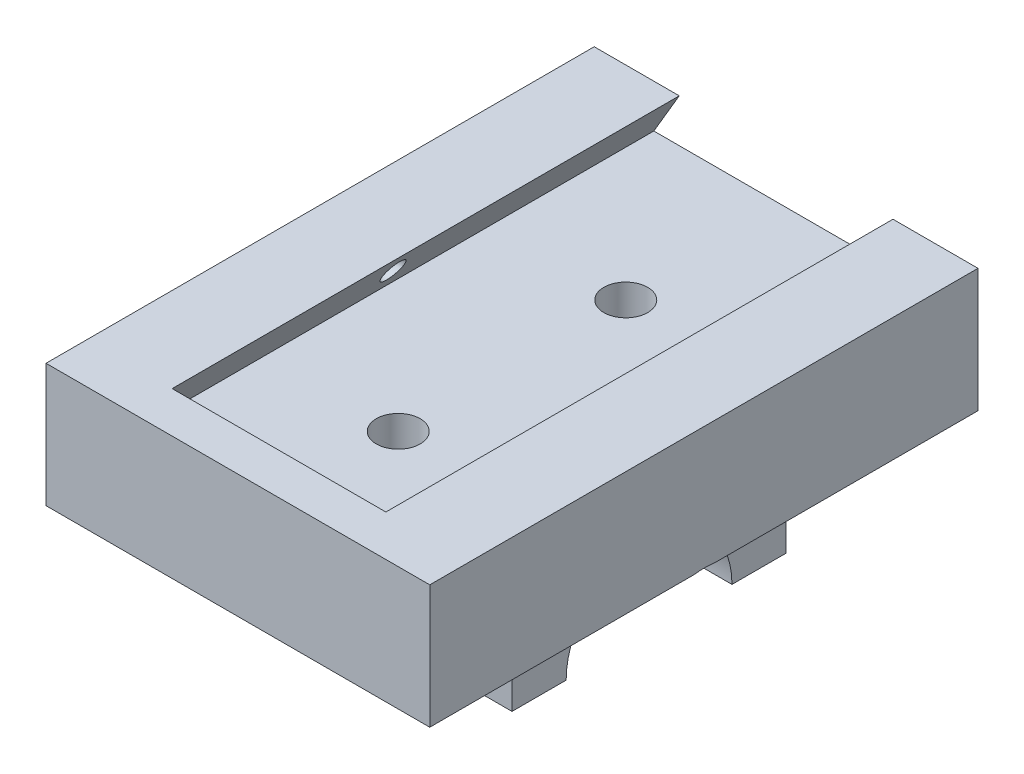
ISO-10303-21;
HEADER;
FILE_DESCRIPTION(('STEP AP214'),'2;1');
FILE_NAME('part.step','',(''),(''),'','','');
FILE_SCHEMA(('AUTOMOTIVE_DESIGN { 1 0 10303 214 1 1 1 1 }'));
ENDSEC;
DATA;
#1=APPLICATION_CONTEXT('core data for automotive mechanical design processes');
#2=APPLICATION_PROTOCOL_DEFINITION('international standard','automotive_design',2000,#1);
#3=PRODUCT_CONTEXT('',#1,'mechanical');
#4=PRODUCT('Part','Part','',(#3));
#5=PRODUCT_RELATED_PRODUCT_CATEGORY('part','',(#4));
#6=PRODUCT_DEFINITION_FORMATION('','',#4);
#7=PRODUCT_DEFINITION_CONTEXT('part definition',#1,'design');
#8=PRODUCT_DEFINITION('design','',#6,#7);
#9=PRODUCT_DEFINITION_SHAPE('','',#8);
#10=(LENGTH_UNIT() NAMED_UNIT(*) SI_UNIT(.MILLI.,.METRE.));
#11=(NAMED_UNIT(*) PLANE_ANGLE_UNIT() SI_UNIT($,.RADIAN.));
#12=(NAMED_UNIT(*) SI_UNIT($,.STERADIAN.) SOLID_ANGLE_UNIT());
#13=UNCERTAINTY_MEASURE_WITH_UNIT(LENGTH_MEASURE(1.E-05),#10,'distance_accuracy_value','');
#14=(GEOMETRIC_REPRESENTATION_CONTEXT(3) GLOBAL_UNCERTAINTY_ASSIGNED_CONTEXT((#13)) GLOBAL_UNIT_ASSIGNED_CONTEXT((#10,
#11,#12)) REPRESENTATION_CONTEXT('',''));
#15=CARTESIAN_POINT('',(0.,0.,0.));
#16=DIRECTION('',(0.,0.,1.));
#17=DIRECTION('',(1.,0.,0.));
#18=AXIS2_PLACEMENT_3D('',#15,#16,#17);
#19=CARTESIAN_POINT('',(-28.,0.,40.));
#20=DIRECTION('',(0.,1.,0.));
#21=DIRECTION('',(0.,0.,1.));
#22=AXIS2_PLACEMENT_3D('',#19,#20,#21);
#23=PLANE('',#22);
#24=DIRECTION('',(0.,0.,-1.));
#25=VECTOR('',#24,1.);
#26=CARTESIAN_POINT('',(-28.,0.,40.));
#27=LINE('',#26,#25);
#28=CARTESIAN_POINT('',(-28.,0.,40.));
#29=VERTEX_POINT('',#28);
#30=CARTESIAN_POINT('',(-28.,0.,1.552417469626));
#31=VERTEX_POINT('',#30);
#32=EDGE_CURVE('E195',#29,#31,#27,.T.);
#33=ORIENTED_EDGE('',*,*,#32,.T.);
#34=DIRECTION('',(1.,0.,0.));
#35=VECTOR('',#34,1.);
#36=CARTESIAN_POINT('',(-28.,0.,1.552417469626));
#37=LINE('',#36,#35);
#38=CARTESIAN_POINT('',(-20.,0.,1.552417469626));
#39=VERTEX_POINT('',#38);
#40=EDGE_CURVE('E172',#31,#39,#37,.T.);
#41=ORIENTED_EDGE('',*,*,#40,.T.);
#42=DIRECTION('',(0.,0.,-1.));
#43=VECTOR('',#42,1.);
#44=CARTESIAN_POINT('',(-20.,0.,40.));
#45=LINE('',#44,#43);
#46=CARTESIAN_POINT('',(-20.,0.,20.));
#47=VERTEX_POINT('',#46);
#48=EDGE_CURVE('E203',#47,#39,#45,.T.);
#49=ORIENTED_EDGE('',*,*,#48,.F.);
#50=DIRECTION('',(-1.,0.,0.));
#51=VECTOR('',#50,1.);
#52=CARTESIAN_POINT('',(-28.,0.,20.));
#53=LINE('',#52,#51);
#54=CARTESIAN_POINT('',(20.,0.,20.));
#55=VERTEX_POINT('',#54);
#56=EDGE_CURVE('E209',#55,#47,#53,.T.);
#57=ORIENTED_EDGE('',*,*,#56,.F.);
#58=DIRECTION('',(0.,0.,-1.));
#59=VECTOR('',#58,1.);
#60=CARTESIAN_POINT('',(20.,0.,40.));
#61=LINE('',#60,#59);
#62=CARTESIAN_POINT('',(20.,0.,1.552417469626));
#63=VERTEX_POINT('',#62);
#64=EDGE_CURVE('E213',#55,#63,#61,.T.);
#65=ORIENTED_EDGE('',*,*,#64,.T.);
#66=CARTESIAN_POINT('',(28.,0.,1.552417469626));
#67=VERTEX_POINT('',#66);
#68=EDGE_CURVE('E243',#63,#67,#37,.T.);
#69=ORIENTED_EDGE('',*,*,#68,.T.);
#70=DIRECTION('',(0.,0.,-1.));
#71=VECTOR('',#70,1.);
#72=CARTESIAN_POINT('',(28.,0.,40.));
#73=LINE('',#72,#71);
#74=CARTESIAN_POINT('',(28.,0.,40.));
#75=VERTEX_POINT('',#74);
#76=EDGE_CURVE('E196',#75,#67,#73,.T.);
#77=ORIENTED_EDGE('',*,*,#76,.F.);
#78=DIRECTION('',(1.,0.,0.));
#79=VECTOR('',#78,1.);
#80=CARTESIAN_POINT('',(-28.,0.,40.));
#81=LINE('',#80,#79);
#82=EDGE_CURVE('E287',#29,#75,#81,.T.);
#83=ORIENTED_EDGE('',*,*,#82,.F.);
#84=EDGE_LOOP('',(#33,#41,#49,#57,#65,#69,#77,#83));
#85=FACE_BOUND('',#84,.T.);
#86=ADVANCED_FACE('F41',(#85),#23,.F.);
#87=CARTESIAN_POINT('',(20.,0.,0.));
#88=DIRECTION('',(1.,0.,0.));
#89=DIRECTION('',(0.,0.,-1.));
#90=AXIS2_PLACEMENT_3D('',#87,#88,#89);
#91=PLANE('',#90);
#92=CARTESIAN_POINT('',(20.,-12.,0.));
#93=DIRECTION('',(1.,0.,0.));
#94=DIRECTION('',(0.,0.,-1.));
#95=AXIS2_PLACEMENT_3D('',#92,#93,#94);
#96=CIRCLE('',#95,12.1);
#97=CARTESIAN_POINT('',(20.,-12.,-12.1));
#98=VERTEX_POINT('',#97);
#99=CARTESIAN_POINT('',(20.,0.,-1.552417469626));
#100=VERTEX_POINT('',#99);
#101=EDGE_CURVE('E189',#98,#100,#96,.T.);
#102=ORIENTED_EDGE('',*,*,#101,.F.);
#103=DIRECTION('',(0.,0.,-1.));
#104=VECTOR('',#103,1.);
#105=CARTESIAN_POINT('',(20.,-12.,20.));
#106=LINE('',#105,#104);
#107=CARTESIAN_POINT('',(20.,-12.,-20.));
#108=VERTEX_POINT('',#107);
#109=EDGE_CURVE('E263',#98,#108,#106,.T.);
#110=ORIENTED_EDGE('',*,*,#109,.T.);
#111=DIRECTION('',(0.,1.,0.));
#112=VECTOR('',#111,1.);
#113=CARTESIAN_POINT('',(20.,-12.,-20.));
#114=LINE('',#113,#112);
#115=CARTESIAN_POINT('',(20.,0.,-20.));
#116=VERTEX_POINT('',#115);
#117=EDGE_CURVE('E268',#108,#116,#114,.T.);
#118=ORIENTED_EDGE('',*,*,#117,.T.);
#119=EDGE_CURVE('E212',#100,#116,#61,.T.);
#120=ORIENTED_EDGE('',*,*,#119,.F.);
#121=EDGE_LOOP('',(#102,#110,#118,#120));
#122=FACE_BOUND('',#121,.T.);
#123=ADVANCED_FACE('F349',(#122),#91,.T.);
#124=CARTESIAN_POINT('',(-20.,0.,0.));
#125=DIRECTION('',(1.,0.,0.));
#126=DIRECTION('',(0.,0.,-1.));
#127=AXIS2_PLACEMENT_3D('',#124,#125,#126);
#128=PLANE('',#127);
#129=DIRECTION('',(0.,0.,-1.));
#130=VECTOR('',#129,1.);
#131=CARTESIAN_POINT('',(-20.,-12.,20.));
#132=LINE('',#131,#130);
#133=CARTESIAN_POINT('',(-20.,-12.,-12.1));
#134=VERTEX_POINT('',#133);
#135=CARTESIAN_POINT('',(-20.,-12.,-20.));
#136=VERTEX_POINT('',#135);
#137=EDGE_CURVE('E273',#134,#136,#132,.T.);
#138=ORIENTED_EDGE('',*,*,#137,.F.);
#139=CARTESIAN_POINT('',(-20.,-12.,0.));
#140=DIRECTION('',(1.,0.,0.));
#141=DIRECTION('',(0.,0.,-1.));
#142=AXIS2_PLACEMENT_3D('',#139,#140,#141);
#143=CIRCLE('',#142,12.1);
#144=CARTESIAN_POINT('',(-20.,0.,-1.552417469626));
#145=VERTEX_POINT('',#144);
#146=EDGE_CURVE('E58',#134,#145,#143,.T.);
#147=ORIENTED_EDGE('',*,*,#146,.T.);
#148=CARTESIAN_POINT('',(-20.,0.,-20.));
#149=VERTEX_POINT('',#148);
#150=EDGE_CURVE('E187',#145,#149,#45,.T.);
#151=ORIENTED_EDGE('',*,*,#150,.T.);
#152=DIRECTION('',(0.,1.,0.));
#153=VECTOR('',#152,1.);
#154=CARTESIAN_POINT('',(-20.,-12.,-20.));
#155=LINE('',#154,#153);
#156=EDGE_CURVE('E264',#136,#149,#155,.T.);
#157=ORIENTED_EDGE('',*,*,#156,.F.);
#158=EDGE_LOOP('',(#138,#147,#151,#157));
#159=FACE_BOUND('',#158,.T.);
#160=ADVANCED_FACE('F355',(#159),#128,.F.);
#161=CARTESIAN_POINT('',(20.,-12.,20.));
#162=DIRECTION('',(0.,1.,0.));
#163=DIRECTION('',(0.,0.,1.));
#164=AXIS2_PLACEMENT_3D('',#161,#162,#163);
#165=PLANE('',#164);
#166=CARTESIAN_POINT('',(0.,-12.,16.6));
#167=DIRECTION('',(0.,1.,0.));
#168=DIRECTION('',(0.,0.,1.));
#169=AXIS2_PLACEMENT_3D('',#166,#167,#168);
#170=CIRCLE('',#169,3.2);
#171=CARTESIAN_POINT('',(0.,-12.,19.8));
#172=VERTEX_POINT('',#171);
#173=EDGE_CURVE('E228',#172,#172,#170,.T.);
#174=ORIENTED_EDGE('',*,*,#173,.T.);
#175=EDGE_LOOP('',(#174));
#176=FACE_BOUND('',#175,.T.);
#177=CARTESIAN_POINT('',(-20.,-12.,20.));
#178=VERTEX_POINT('',#177);
#179=CARTESIAN_POINT('',(-20.,-12.,12.1));
#180=VERTEX_POINT('',#179);
#181=EDGE_CURVE('E274',#178,#180,#132,.T.);
#182=ORIENTED_EDGE('',*,*,#181,.T.);
#183=DIRECTION('',(1.,0.,0.));
#184=VECTOR('',#183,1.);
#185=CARTESIAN_POINT('',(-28.,-12.,12.1));
#186=LINE('',#185,#184);
#187=CARTESIAN_POINT('',(20.,-12.,12.1));
#188=VERTEX_POINT('',#187);
#189=EDGE_CURVE('E11',#180,#188,#186,.T.);
#190=ORIENTED_EDGE('',*,*,#189,.T.);
#191=CARTESIAN_POINT('',(20.,-12.,20.));
#192=VERTEX_POINT('',#191);
#193=EDGE_CURVE('E265',#192,#188,#106,.T.);
#194=ORIENTED_EDGE('',*,*,#193,.F.);
#195=DIRECTION('',(-1.,0.,0.));
#196=VECTOR('',#195,1.);
#197=CARTESIAN_POINT('',(20.,-12.,20.));
#198=LINE('',#197,#196);
#199=EDGE_CURVE('E281',#192,#178,#198,.T.);
#200=ORIENTED_EDGE('',*,*,#199,.T.);
#201=EDGE_LOOP('',(#182,#190,#194,#200));
#202=FACE_BOUND('',#201,.T.);
#203=ADVANCED_FACE('F420',(#176,#202),#165,.F.);
#204=CARTESIAN_POINT('',(28.,18.,40.));
#205=DIRECTION('',(0.,-1.,0.));
#206=DIRECTION('',(0.,0.,-1.));
#207=AXIS2_PLACEMENT_3D('',#204,#205,#206);
#208=PLANE('',#207);
#209=DIRECTION('',(0.,0.,1.));
#210=VECTOR('',#209,1.);
#211=CARTESIAN_POINT('',(-15.5941176470588,18.,40.));
#212=LINE('',#211,#210);
#213=CARTESIAN_POINT('',(-15.5941176470588,18.,-40.));
#214=VERTEX_POINT('',#213);
#215=CARTESIAN_POINT('',(-15.5941176470588,18.,34.));
#216=VERTEX_POINT('',#215);
#217=EDGE_CURVE('E258',#214,#216,#212,.T.);
#218=ORIENTED_EDGE('',*,*,#217,.F.);
#219=DIRECTION('',(-1.,0.,0.));
#220=VECTOR('',#219,1.);
#221=CARTESIAN_POINT('',(28.,18.,-40.));
#222=LINE('',#221,#220);
#223=CARTESIAN_POINT('',(-28.,18.,-40.));
#224=VERTEX_POINT('',#223);
#225=EDGE_CURVE('E300',#214,#224,#222,.T.);
#226=ORIENTED_EDGE('',*,*,#225,.T.);
#227=DIRECTION('',(0.,0.,-1.));
#228=VECTOR('',#227,1.);
#229=CARTESIAN_POINT('',(-28.,18.,40.));
#230=LINE('',#229,#228);
#231=CARTESIAN_POINT('',(-28.,18.,40.));
#232=VERTEX_POINT('',#231);
#233=EDGE_CURVE('E294',#232,#224,#230,.T.);
#234=ORIENTED_EDGE('',*,*,#233,.F.);
#235=DIRECTION('',(-1.,0.,0.));
#236=VECTOR('',#235,1.);
#237=CARTESIAN_POINT('',(28.,18.,40.));
#238=LINE('',#237,#236);
#239=CARTESIAN_POINT('',(28.,18.,40.));
#240=VERTEX_POINT('',#239);
#241=EDGE_CURVE('E292',#240,#232,#238,.T.);
#242=ORIENTED_EDGE('',*,*,#241,.F.);
#243=DIRECTION('',(0.,0.,-1.));
#244=VECTOR('',#243,1.);
#245=CARTESIAN_POINT('',(28.,18.,40.));
#246=LINE('',#245,#244);
#247=CARTESIAN_POINT('',(28.,18.,-40.));
#248=VERTEX_POINT('',#247);
#249=EDGE_CURVE('E303',#240,#248,#246,.T.);
#250=ORIENTED_EDGE('',*,*,#249,.T.);
#251=CARTESIAN_POINT('',(15.5941176470588,18.,-40.));
#252=VERTEX_POINT('',#251);
#253=EDGE_CURVE('E288',#248,#252,#222,.T.);
#254=ORIENTED_EDGE('',*,*,#253,.T.);
#255=DIRECTION('',(0.,0.,-1.));
#256=VECTOR('',#255,1.);
#257=CARTESIAN_POINT('',(15.5941176470588,18.,40.));
#258=LINE('',#257,#256);
#259=CARTESIAN_POINT('',(15.5941176470588,18.,34.));
#260=VERTEX_POINT('',#259);
#261=EDGE_CURVE('E66',#260,#252,#258,.T.);
#262=ORIENTED_EDGE('',*,*,#261,.F.);
#263=DIRECTION('',(1.,0.,0.));
#264=VECTOR('',#263,1.);
#265=CARTESIAN_POINT('',(28.,18.,34.));
#266=LINE('',#265,#264);
#267=EDGE_CURVE('E222',#216,#260,#266,.T.);
#268=ORIENTED_EDGE('',*,*,#267,.F.);
#269=EDGE_LOOP('',(#218,#226,#234,#242,#250,#254,#262,#268));
#270=FACE_BOUND('',#269,.T.);
#271=ADVANCED_FACE('F318',(#270),#208,.F.);
#272=CARTESIAN_POINT('',(0.,0.,-40.));
#273=DIRECTION('',(0.,0.,1.));
#274=DIRECTION('',(1.,0.,0.));
#275=AXIS2_PLACEMENT_3D('',#272,#273,#274);
#276=PLANE('',#275);
#277=DIRECTION('',(0.507020126563394,0.86193421515777,0.));
#278=VECTOR('',#277,1.);
#279=CARTESIAN_POINT('',(-19.4516709511568,11.4421593830334,-40.));
#280=LINE('',#279,#278);
#281=CARTESIAN_POINT('',(-19.3,11.7,-40.));
#282=VERTEX_POINT('',#281);
#283=EDGE_CURVE('E220',#282,#214,#280,.T.);
#284=ORIENTED_EDGE('',*,*,#283,.F.);
#285=DIRECTION('',(-1.,0.,0.));
#286=VECTOR('',#285,1.);
#287=CARTESIAN_POINT('',(0.,11.7,-40.));
#288=LINE('',#287,#286);
#289=CARTESIAN_POINT('',(19.3,11.7,-40.));
#290=VERTEX_POINT('',#289);
#291=EDGE_CURVE('E218',#290,#282,#288,.T.);
#292=ORIENTED_EDGE('',*,*,#291,.F.);
#293=DIRECTION('',(0.507020126563394,-0.86193421515777,0.));
#294=VECTOR('',#293,1.);
#295=CARTESIAN_POINT('',(19.4516709511568,11.4421593830334,-40.));
#296=LINE('',#295,#294);
#297=EDGE_CURVE('E216',#252,#290,#296,.T.);
#298=ORIENTED_EDGE('',*,*,#297,.F.);
#299=ORIENTED_EDGE('',*,*,#253,.F.);
#300=DIRECTION('',(0.,1.,0.));
#301=VECTOR('',#300,1.);
#302=CARTESIAN_POINT('',(28.,0.,-40.));
#303=LINE('',#302,#301);
#304=CARTESIAN_POINT('',(28.,0.,-40.));
#305=VERTEX_POINT('',#304);
#306=EDGE_CURVE('E298',#305,#248,#303,.T.);
#307=ORIENTED_EDGE('',*,*,#306,.F.);
#308=DIRECTION('',(1.,0.,0.));
#309=VECTOR('',#308,1.);
#310=CARTESIAN_POINT('',(-28.,0.,-40.));
#311=LINE('',#310,#309);
#312=CARTESIAN_POINT('',(-28.,0.,-40.));
#313=VERTEX_POINT('',#312);
#314=EDGE_CURVE('E296',#313,#305,#311,.T.);
#315=ORIENTED_EDGE('',*,*,#314,.F.);
#316=DIRECTION('',(0.,-1.,0.));
#317=VECTOR('',#316,1.);
#318=CARTESIAN_POINT('',(-28.,18.,-40.));
#319=LINE('',#318,#317);
#320=EDGE_CURVE('E194',#224,#313,#319,.T.);
#321=ORIENTED_EDGE('',*,*,#320,.F.);
#322=ORIENTED_EDGE('',*,*,#225,.F.);
#323=EDGE_LOOP('',(#284,#292,#298,#299,#307,#315,#321,#322));
#324=FACE_BOUND('',#323,.T.);
#325=ADVANCED_FACE('F315',(#324),#276,.F.);
#326=CARTESIAN_POINT('',(-28.,18.,40.));
#327=DIRECTION('',(1.,0.,0.));
#328=DIRECTION('',(0.,0.,-1.));
#329=AXIS2_PLACEMENT_3D('',#326,#327,#328);
#330=PLANE('',#329);
#331=CARTESIAN_POINT('',(-28.,15.,0.));
#332=DIRECTION('',(1.,0.,0.));
#333=DIRECTION('',(0.,0.,-1.));
#334=AXIS2_PLACEMENT_3D('',#331,#332,#333);
#335=CIRCLE('',#334,1.65);
#336=CARTESIAN_POINT('',(-28.,15.,-1.65));
#337=VERTEX_POINT('',#336);
#338=EDGE_CURVE('E373',#337,#337,#335,.T.);
#339=ORIENTED_EDGE('',*,*,#338,.T.);
#340=EDGE_LOOP('',(#339));
#341=FACE_BOUND('',#340,.T.);
#342=CARTESIAN_POINT('',(-28.,0.,-1.552417469626));
#343=VERTEX_POINT('',#342);
#344=EDGE_CURVE('E184',#343,#313,#27,.T.);
#345=ORIENTED_EDGE('',*,*,#344,.F.);
#346=CARTESIAN_POINT('',(-28.,-12.,0.));
#347=DIRECTION('',(1.,0.,0.));
#348=DIRECTION('',(0.,0.,-1.));
#349=AXIS2_PLACEMENT_3D('',#346,#347,#348);
#350=CIRCLE('',#349,12.1);
#351=EDGE_CURVE('E167',#343,#31,#350,.T.);
#352=ORIENTED_EDGE('',*,*,#351,.T.);
#353=ORIENTED_EDGE('',*,*,#32,.F.);
#354=DIRECTION('',(0.,-1.,0.));
#355=VECTOR('',#354,1.);
#356=CARTESIAN_POINT('',(-28.,18.,40.));
#357=LINE('',#356,#355);
#358=EDGE_CURVE('E284',#232,#29,#357,.T.);
#359=ORIENTED_EDGE('',*,*,#358,.F.);
#360=ORIENTED_EDGE('',*,*,#233,.T.);
#361=ORIENTED_EDGE('',*,*,#320,.T.);
#362=EDGE_LOOP('',(#345,#352,#353,#359,#360,#361));
#363=FACE_BOUND('',#362,.T.);
#364=ADVANCED_FACE('F43',(#341,#363),#330,.F.);
#365=CARTESIAN_POINT('',(28.,0.,-1.552417469626));
#366=VERTEX_POINT('',#365);
#367=EDGE_CURVE('E199',#366,#305,#73,.T.);
#368=ORIENTED_EDGE('',*,*,#367,.F.);
#369=DIRECTION('',(1.,0.,0.));
#370=VECTOR('',#369,1.);
#371=CARTESIAN_POINT('',(-28.,0.,-1.552417469626));
#372=LINE('',#371,#370);
#373=EDGE_CURVE('E188',#366,#100,#372,.F.);
#374=ORIENTED_EDGE('',*,*,#373,.T.);
#375=ORIENTED_EDGE('',*,*,#119,.T.);
#376=DIRECTION('',(1.,0.,0.));
#377=VECTOR('',#376,1.);
#378=CARTESIAN_POINT('',(-28.,0.,-20.));
#379=LINE('',#378,#377);
#380=EDGE_CURVE('E206',#149,#116,#379,.T.);
#381=ORIENTED_EDGE('',*,*,#380,.F.);
#382=ORIENTED_EDGE('',*,*,#150,.F.);
#383=EDGE_CURVE('E170',#145,#343,#372,.F.);
#384=ORIENTED_EDGE('',*,*,#383,.T.);
#385=ORIENTED_EDGE('',*,*,#344,.T.);
#386=ORIENTED_EDGE('',*,*,#314,.T.);
#387=EDGE_LOOP('',(#368,#374,#375,#381,#382,#384,#385,#386));
#388=FACE_BOUND('',#387,.T.);
#389=ADVANCED_FACE('F182',(#388),#23,.F.);
#390=CARTESIAN_POINT('',(28.,0.,40.));
#391=DIRECTION('',(-1.,0.,0.));
#392=DIRECTION('',(0.,0.,1.));
#393=AXIS2_PLACEMENT_3D('',#390,#391,#392);
#394=PLANE('',#393);
#395=ORIENTED_EDGE('',*,*,#76,.T.);
#396=CARTESIAN_POINT('',(28.,-12.,0.));
#397=DIRECTION('',(1.,0.,0.));
#398=DIRECTION('',(0.,0.,-1.));
#399=AXIS2_PLACEMENT_3D('',#396,#397,#398);
#400=CIRCLE('',#399,12.1);
#401=EDGE_CURVE('E177',#366,#67,#400,.T.);
#402=ORIENTED_EDGE('',*,*,#401,.F.);
#403=ORIENTED_EDGE('',*,*,#367,.T.);
#404=ORIENTED_EDGE('',*,*,#306,.T.);
#405=ORIENTED_EDGE('',*,*,#249,.F.);
#406=DIRECTION('',(0.,1.,0.));
#407=VECTOR('',#406,1.);
#408=CARTESIAN_POINT('',(28.,0.,40.));
#409=LINE('',#408,#407);
#410=EDGE_CURVE('E290',#75,#240,#409,.T.);
#411=ORIENTED_EDGE('',*,*,#410,.F.);
#412=EDGE_LOOP('',(#395,#402,#403,#404,#405,#411));
#413=FACE_BOUND('',#412,.T.);
#414=ADVANCED_FACE('F310',(#413),#394,.F.);
#415=CARTESIAN_POINT('',(0.,0.,40.));
#416=DIRECTION('',(0.,0.,1.));
#417=DIRECTION('',(1.,0.,0.));
#418=AXIS2_PLACEMENT_3D('',#415,#416,#417);
#419=PLANE('',#418);
#420=ORIENTED_EDGE('',*,*,#358,.T.);
#421=ORIENTED_EDGE('',*,*,#82,.T.);
#422=ORIENTED_EDGE('',*,*,#410,.T.);
#423=ORIENTED_EDGE('',*,*,#241,.T.);
#424=EDGE_LOOP('',(#420,#421,#422,#423));
#425=FACE_BOUND('',#424,.T.);
#426=ADVANCED_FACE('F364',(#425),#419,.T.);
#427=CARTESIAN_POINT('',(20.,0.5,20.));
#428=DIRECTION('',(0.,0.,-1.));
#429=DIRECTION('',(-1.,0.,0.));
#430=AXIS2_PLACEMENT_3D('',#427,#428,#429);
#431=PLANE('',#430);
#432=DIRECTION('',(0.,-1.,0.));
#433=VECTOR('',#432,1.);
#434=CARTESIAN_POINT('',(20.,0.5,20.));
#435=LINE('',#434,#433);
#436=EDGE_CURVE('E261',#55,#192,#435,.T.);
#437=ORIENTED_EDGE('',*,*,#436,.F.);
#438=ORIENTED_EDGE('',*,*,#56,.T.);
#439=DIRECTION('',(0.,-1.,0.));
#440=VECTOR('',#439,1.);
#441=CARTESIAN_POINT('',(-20.,0.5,20.));
#442=LINE('',#441,#440);
#443=EDGE_CURVE('E260',#47,#178,#442,.T.);
#444=ORIENTED_EDGE('',*,*,#443,.T.);
#445=ORIENTED_EDGE('',*,*,#199,.F.);
#446=EDGE_LOOP('',(#437,#438,#444,#445));
#447=FACE_BOUND('',#446,.T.);
#448=ADVANCED_FACE('F427',(#447),#431,.F.);
#449=CARTESIAN_POINT('',(20.,-12.,-20.));
#450=DIRECTION('',(0.,0.,1.));
#451=DIRECTION('',(1.,0.,0.));
#452=AXIS2_PLACEMENT_3D('',#449,#450,#451);
#453=PLANE('',#452);
#454=ORIENTED_EDGE('',*,*,#156,.T.);
#455=ORIENTED_EDGE('',*,*,#380,.T.);
#456=ORIENTED_EDGE('',*,*,#117,.F.);
#457=DIRECTION('',(-1.,0.,0.));
#458=VECTOR('',#457,1.);
#459=CARTESIAN_POINT('',(20.,-12.,-20.));
#460=LINE('',#459,#458);
#461=EDGE_CURVE('E271',#108,#136,#460,.T.);
#462=ORIENTED_EDGE('',*,*,#461,.T.);
#463=EDGE_LOOP('',(#454,#455,#456,#462));
#464=FACE_BOUND('',#463,.T.);
#465=ADVANCED_FACE('F423',(#464),#453,.F.);
#466=EDGE_CURVE('E241',#63,#188,#96,.T.);
#467=ORIENTED_EDGE('',*,*,#466,.F.);
#468=ORIENTED_EDGE('',*,*,#64,.F.);
#469=ORIENTED_EDGE('',*,*,#436,.T.);
#470=ORIENTED_EDGE('',*,*,#193,.T.);
#471=EDGE_LOOP('',(#467,#468,#469,#470));
#472=FACE_BOUND('',#471,.T.);
#473=ADVANCED_FACE('F357',(#472),#91,.T.);
#474=ORIENTED_EDGE('',*,*,#48,.T.);
#475=EDGE_CURVE('E240',#39,#180,#143,.T.);
#476=ORIENTED_EDGE('',*,*,#475,.T.);
#477=ORIENTED_EDGE('',*,*,#181,.F.);
#478=ORIENTED_EDGE('',*,*,#443,.F.);
#479=EDGE_LOOP('',(#474,#476,#477,#478));
#480=FACE_BOUND('',#479,.T.);
#481=ADVANCED_FACE('F467',(#480),#128,.F.);
#482=CARTESIAN_POINT('',(0.,-12.,-16.6));
#483=DIRECTION('',(0.,1.,0.));
#484=DIRECTION('',(0.,0.,1.));
#485=AXIS2_PLACEMENT_3D('',#482,#483,#484);
#486=CIRCLE('',#485,3.2);
#487=CARTESIAN_POINT('',(0.,-12.,-13.4));
#488=VERTEX_POINT('',#487);
#489=EDGE_CURVE('E236',#488,#488,#486,.T.);
#490=ORIENTED_EDGE('',*,*,#489,.T.);
#491=EDGE_LOOP('',(#490));
#492=FACE_BOUND('',#491,.T.);
#493=ORIENTED_EDGE('',*,*,#109,.F.);
#494=DIRECTION('',(1.,0.,0.));
#495=VECTOR('',#494,1.);
#496=CARTESIAN_POINT('',(-28.,-12.,-12.1));
#497=LINE('',#496,#495);
#498=EDGE_CURVE('E50',#98,#134,#497,.F.);
#499=ORIENTED_EDGE('',*,*,#498,.T.);
#500=ORIENTED_EDGE('',*,*,#137,.T.);
#501=ORIENTED_EDGE('',*,*,#461,.F.);
#502=EDGE_LOOP('',(#493,#499,#500,#501));
#503=FACE_BOUND('',#502,.T.);
#504=ADVANCED_FACE('F344',(#492,#503),#165,.F.);
#505=CARTESIAN_POINT('',(0.,0.,34.));
#506=DIRECTION('',(0.,0.,-1.));
#507=DIRECTION('',(-1.,0.,0.));
#508=AXIS2_PLACEMENT_3D('',#505,#506,#507);
#509=PLANE('',#508);
#510=ORIENTED_EDGE('',*,*,#267,.T.);
#511=DIRECTION('',(-0.507020126563394,0.861934215157769,0.));
#512=VECTOR('',#511,1.);
#513=CARTESIAN_POINT('',(15.3,18.5,34.));
#514=LINE('',#513,#512);
#515=CARTESIAN_POINT('',(19.3,11.7,34.));
#516=VERTEX_POINT('',#515);
#517=EDGE_CURVE('E249',#516,#260,#514,.T.);
#518=ORIENTED_EDGE('',*,*,#517,.F.);
#519=DIRECTION('',(1.,0.,0.));
#520=VECTOR('',#519,1.);
#521=CARTESIAN_POINT('',(19.3,11.7,34.));
#522=LINE('',#521,#520);
#523=CARTESIAN_POINT('',(-19.3,11.7,34.));
#524=VERTEX_POINT('',#523);
#525=EDGE_CURVE('E247',#524,#516,#522,.T.);
#526=ORIENTED_EDGE('',*,*,#525,.F.);
#527=DIRECTION('',(-0.507020126563394,-0.861934215157769,0.));
#528=VECTOR('',#527,1.);
#529=CARTESIAN_POINT('',(-19.3,11.7,34.));
#530=LINE('',#529,#528);
#531=EDGE_CURVE('E245',#216,#524,#530,.T.);
#532=ORIENTED_EDGE('',*,*,#531,.F.);
#533=EDGE_LOOP('',(#510,#518,#526,#532));
#534=FACE_BOUND('',#533,.T.);
#535=ADVANCED_FACE('F324',(#534),#509,.T.);
#536=CARTESIAN_POINT('',(-19.3,11.7,34.));
#537=DIRECTION('',(0.86193421515777,-0.507020126563394,0.));
#538=DIRECTION('',(0.507020126563394,0.86193421515777,0.));
#539=AXIS2_PLACEMENT_3D('',#536,#537,#538);
#540=PLANE('',#539);
#541=CARTESIAN_POINT('',(-17.3588235294118,15.,0.));
#542=DIRECTION('',(0.86193421515777,-0.507020126563394,0.));
#543=DIRECTION('',(0.507020126563394,0.86193421515777,0.));
#544=AXIS2_PLACEMENT_3D('',#541,#542,#543);
#545=ELLIPSE('',#544,1.91429922491008,1.65);
#546=CARTESIAN_POINT('',(-16.3882352941176,16.65,0.));
#547=VERTEX_POINT('',#546);
#548=EDGE_CURVE('E45',#547,#547,#545,.T.);
#549=ORIENTED_EDGE('',*,*,#548,.F.);
#550=EDGE_LOOP('',(#549));
#551=FACE_BOUND('',#550,.T.);
#552=ORIENTED_EDGE('',*,*,#217,.T.);
#553=ORIENTED_EDGE('',*,*,#531,.T.);
#554=DIRECTION('',(0.,0.,-1.));
#555=VECTOR('',#554,1.);
#556=CARTESIAN_POINT('',(-19.3,11.7,34.));
#557=LINE('',#556,#555);
#558=EDGE_CURVE('E254',#524,#282,#557,.T.);
#559=ORIENTED_EDGE('',*,*,#558,.T.);
#560=ORIENTED_EDGE('',*,*,#283,.T.);
#561=EDGE_LOOP('',(#552,#553,#559,#560));
#562=FACE_BOUND('',#561,.T.);
#563=ADVANCED_FACE('F332',(#551,#562),#540,.T.);
#564=CARTESIAN_POINT('',(19.3,11.7,34.));
#565=DIRECTION('',(0.,1.,0.));
#566=DIRECTION('',(0.,0.,1.));
#567=AXIS2_PLACEMENT_3D('',#564,#565,#566);
#568=PLANE('',#567);
#569=CARTESIAN_POINT('',(0.,11.7,16.6));
#570=DIRECTION('',(0.,1.,0.));
#571=DIRECTION('',(0.,0.,1.));
#572=AXIS2_PLACEMENT_3D('',#569,#570,#571);
#573=CIRCLE('',#572,3.2);
#574=CARTESIAN_POINT('',(0.,11.7,19.8));
#575=VERTEX_POINT('',#574);
#576=EDGE_CURVE('E227',#575,#575,#573,.T.);
#577=ORIENTED_EDGE('',*,*,#576,.F.);
#578=EDGE_LOOP('',(#577));
#579=FACE_BOUND('',#578,.T.);
#580=CARTESIAN_POINT('',(0.,11.7,-16.6));
#581=DIRECTION('',(0.,1.,0.));
#582=DIRECTION('',(0.,0.,1.));
#583=AXIS2_PLACEMENT_3D('',#580,#581,#582);
#584=CIRCLE('',#583,3.2);
#585=CARTESIAN_POINT('',(0.,11.7,-13.4));
#586=VERTEX_POINT('',#585);
#587=EDGE_CURVE('E225',#586,#586,#584,.T.);
#588=ORIENTED_EDGE('',*,*,#587,.F.);
#589=EDGE_LOOP('',(#588));
#590=FACE_BOUND('',#589,.T.);
#591=ORIENTED_EDGE('',*,*,#291,.T.);
#592=ORIENTED_EDGE('',*,*,#558,.F.);
#593=ORIENTED_EDGE('',*,*,#525,.T.);
#594=DIRECTION('',(0.,0.,-1.));
#595=VECTOR('',#594,1.);
#596=CARTESIAN_POINT('',(19.3,11.7,34.));
#597=LINE('',#596,#595);
#598=EDGE_CURVE('E251',#516,#290,#597,.T.);
#599=ORIENTED_EDGE('',*,*,#598,.T.);
#600=EDGE_LOOP('',(#591,#592,#593,#599));
#601=FACE_BOUND('',#600,.T.);
#602=ADVANCED_FACE('F329',(#579,#590,#601),#568,.T.);
#603=CARTESIAN_POINT('',(15.3,18.5,34.));
#604=DIRECTION('',(-0.86193421515777,-0.507020126563394,0.));
#605=DIRECTION('',(0.507020126563394,-0.86193421515777,0.));
#606=AXIS2_PLACEMENT_3D('',#603,#604,#605);
#607=PLANE('',#606);
#608=ORIENTED_EDGE('',*,*,#261,.T.);
#609=ORIENTED_EDGE('',*,*,#297,.T.);
#610=ORIENTED_EDGE('',*,*,#598,.F.);
#611=ORIENTED_EDGE('',*,*,#517,.T.);
#612=EDGE_LOOP('',(#608,#609,#610,#611));
#613=FACE_BOUND('',#612,.T.);
#614=ADVANCED_FACE('F327',(#613),#607,.T.);
#615=CARTESIAN_POINT('',(-28.,-12.,0.));
#616=DIRECTION('',(1.,0.,0.));
#617=DIRECTION('',(0.,0.,-1.));
#618=AXIS2_PLACEMENT_3D('',#615,#616,#617);
#619=CYLINDRICAL_SURFACE('',#618,12.1);
#620=ORIENTED_EDGE('',*,*,#351,.F.);
#621=ORIENTED_EDGE('',*,*,#383,.F.);
#622=ORIENTED_EDGE('',*,*,#146,.F.);
#623=ORIENTED_EDGE('',*,*,#498,.F.);
#624=ORIENTED_EDGE('',*,*,#101,.T.);
#625=ORIENTED_EDGE('',*,*,#373,.F.);
#626=ORIENTED_EDGE('',*,*,#401,.T.);
#627=ORIENTED_EDGE('',*,*,#68,.F.);
#628=ORIENTED_EDGE('',*,*,#466,.T.);
#629=ORIENTED_EDGE('',*,*,#189,.F.);
#630=ORIENTED_EDGE('',*,*,#475,.F.);
#631=ORIENTED_EDGE('',*,*,#40,.F.);
#632=EDGE_LOOP('',(#620,#621,#622,#623,#624,#625,#626,#627,#628,#629,#630,#631));
#633=FACE_BOUND('',#632,.T.);
#634=ADVANCED_FACE('F169',(#633),#619,.F.);
#635=CARTESIAN_POINT('',(0.,-12.,-16.6));
#636=DIRECTION('',(0.,1.,0.));
#637=DIRECTION('',(0.,0.,1.));
#638=AXIS2_PLACEMENT_3D('',#635,#636,#637);
#639=CYLINDRICAL_SURFACE('',#638,3.2);
#640=ORIENTED_EDGE('',*,*,#587,.T.);
#641=EDGE_LOOP('',(#640));
#642=FACE_BOUND('',#641,.T.);
#643=ORIENTED_EDGE('',*,*,#489,.F.);
#644=EDGE_LOOP('',(#643));
#645=FACE_BOUND('',#644,.T.);
#646=ADVANCED_FACE('F385',(#642,#645),#639,.F.);
#647=CARTESIAN_POINT('',(0.,-12.,16.6));
#648=DIRECTION('',(0.,1.,0.));
#649=DIRECTION('',(0.,0.,1.));
#650=AXIS2_PLACEMENT_3D('',#647,#648,#649);
#651=CYLINDRICAL_SURFACE('',#650,3.2);
#652=ORIENTED_EDGE('',*,*,#576,.T.);
#653=EDGE_LOOP('',(#652));
#654=FACE_BOUND('',#653,.T.);
#655=ORIENTED_EDGE('',*,*,#173,.F.);
#656=EDGE_LOOP('',(#655));
#657=FACE_BOUND('',#656,.T.);
#658=ADVANCED_FACE('F387',(#654,#657),#651,.F.);
#659=CARTESIAN_POINT('',(-28.,15.,0.));
#660=DIRECTION('',(1.,0.,0.));
#661=DIRECTION('',(0.,0.,-1.));
#662=AXIS2_PLACEMENT_3D('',#659,#660,#661);
#663=CYLINDRICAL_SURFACE('',#662,1.65);
#664=ORIENTED_EDGE('',*,*,#548,.T.);
#665=EDGE_LOOP('',(#664));
#666=FACE_BOUND('',#665,.T.);
#667=ORIENTED_EDGE('',*,*,#338,.F.);
#668=EDGE_LOOP('',(#667));
#669=FACE_BOUND('',#668,.T.);
#670=ADVANCED_FACE('F392',(#666,#669),#663,.F.);
#671=CLOSED_SHELL('',(#86,#123,#160,#203,#271,#325,#364,#389,#414,#426,#448,#465,#473,#481,#504,
#535,#563,#602,#614,#634,#646,#658,#670));
#672=MANIFOLD_SOLID_BREP('B2',#671);
#673=ADVANCED_BREP_SHAPE_REPRESENTATION('',(#18,#672),#14);
#674=SHAPE_DEFINITION_REPRESENTATION(#9,#673);
ENDSEC;
END-ISO-10303-21;
